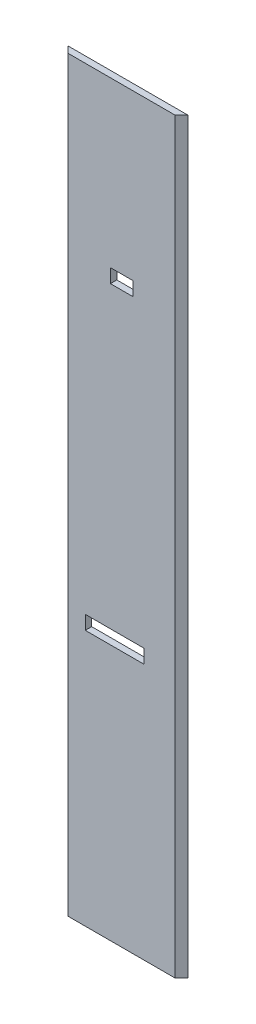
ISO-10303-21;
HEADER;
FILE_DESCRIPTION(('STEP AP214'),'2;1');
FILE_NAME('part.step','',(''),(''),'','','');
FILE_SCHEMA(('AUTOMOTIVE_DESIGN { 1 0 10303 214 1 1 1 1 }'));
ENDSEC;
DATA;
#1=APPLICATION_CONTEXT('core data for automotive mechanical design processes');
#2=APPLICATION_PROTOCOL_DEFINITION('international standard','automotive_design',2000,#1);
#3=PRODUCT_CONTEXT('',#1,'mechanical');
#4=PRODUCT('Part','Part','',(#3));
#5=PRODUCT_RELATED_PRODUCT_CATEGORY('part','',(#4));
#6=PRODUCT_DEFINITION_FORMATION('','',#4);
#7=PRODUCT_DEFINITION_CONTEXT('part definition',#1,'design');
#8=PRODUCT_DEFINITION('design','',#6,#7);
#9=PRODUCT_DEFINITION_SHAPE('','',#8);
#10=(LENGTH_UNIT() NAMED_UNIT(*) SI_UNIT(.MILLI.,.METRE.));
#11=(NAMED_UNIT(*) PLANE_ANGLE_UNIT() SI_UNIT($,.RADIAN.));
#12=(NAMED_UNIT(*) SI_UNIT($,.STERADIAN.) SOLID_ANGLE_UNIT());
#13=UNCERTAINTY_MEASURE_WITH_UNIT(LENGTH_MEASURE(1.E-05),#10,'distance_accuracy_value','');
#14=(GEOMETRIC_REPRESENTATION_CONTEXT(3) GLOBAL_UNCERTAINTY_ASSIGNED_CONTEXT((#13)) GLOBAL_UNIT_ASSIGNED_CONTEXT((#10,
#11,#12)) REPRESENTATION_CONTEXT('',''));
#15=CARTESIAN_POINT('',(0.,0.,0.));
#16=DIRECTION('',(0.,0.,1.));
#17=DIRECTION('',(1.,0.,0.));
#18=AXIS2_PLACEMENT_3D('',#15,#16,#17);
#19=CARTESIAN_POINT('',(25.,175.,3.));
#20=DIRECTION('',(0.707106781186554,0.,0.707106781186541));
#21=DIRECTION('',(0.707106781186541,0.,-0.707106781186554));
#22=AXIS2_PLACEMENT_3D('',#19,#20,#21);
#23=PLANE('',#22);
#24=DIRECTION('',(-0.707106781186541,0.,0.707106781186554));
#25=VECTOR('',#24,1.);
#26=CARTESIAN_POINT('',(25.,-175.,3.));
#27=LINE('',#26,#25);
#28=CARTESIAN_POINT('',(27.9999999999999,-175.,0.));
#29=VERTEX_POINT('',#28);
#30=CARTESIAN_POINT('',(25.,-175.,3.));
#31=VERTEX_POINT('',#30);
#32=EDGE_CURVE('E240',#29,#31,#27,.T.);
#33=ORIENTED_EDGE('',*,*,#32,.F.);
#34=DIRECTION('',(0.,-1.,0.));
#35=VECTOR('',#34,1.);
#36=CARTESIAN_POINT('',(27.9999999999999,175.,0.));
#37=LINE('',#36,#35);
#38=CARTESIAN_POINT('',(27.9999999999999,175.,0.));
#39=VERTEX_POINT('',#38);
#40=EDGE_CURVE('E230',#39,#29,#37,.T.);
#41=ORIENTED_EDGE('',*,*,#40,.F.);
#42=DIRECTION('',(-0.707106781186541,0.,0.707106781186554));
#43=VECTOR('',#42,1.);
#44=CARTESIAN_POINT('',(25.,175.,3.));
#45=LINE('',#44,#43);
#46=CARTESIAN_POINT('',(25.,175.,3.));
#47=VERTEX_POINT('',#46);
#48=EDGE_CURVE('E248',#39,#47,#45,.T.);
#49=ORIENTED_EDGE('',*,*,#48,.T.);
#50=DIRECTION('',(0.,1.,0.));
#51=VECTOR('',#50,1.);
#52=CARTESIAN_POINT('',(25.,-175.,3.));
#53=LINE('',#52,#51);
#54=EDGE_CURVE('E11',#31,#47,#53,.T.);
#55=ORIENTED_EDGE('',*,*,#54,.F.);
#56=EDGE_LOOP('',(#33,#41,#49,#55));
#57=FACE_BOUND('',#56,.T.);
#58=ADVANCED_FACE('F45',(#57),#23,.T.);
#59=CARTESIAN_POINT('',(25.,175.,3.));
#60=DIRECTION('',(0.,-1.,0.));
#61=DIRECTION('',(0.,0.,-1.));
#62=AXIS2_PLACEMENT_3D('',#59,#60,#61);
#63=PLANE('',#62);
#64=DIRECTION('',(-1.,0.,0.));
#65=VECTOR('',#64,1.);
#66=CARTESIAN_POINT('',(25.,175.,0.));
#67=LINE('',#66,#65);
#68=CARTESIAN_POINT('',(-27.9999999999999,175.,0.));
#69=VERTEX_POINT('',#68);
#70=EDGE_CURVE('E244',#39,#69,#67,.T.);
#71=ORIENTED_EDGE('',*,*,#70,.T.);
#72=DIRECTION('',(-0.707106781186541,0.,-0.707106781186554));
#73=VECTOR('',#72,1.);
#74=CARTESIAN_POINT('',(-25.,175.,3.));
#75=LINE('',#74,#73);
#76=CARTESIAN_POINT('',(-25.,175.,3.));
#77=VERTEX_POINT('',#76);
#78=EDGE_CURVE('E231',#77,#69,#75,.T.);
#79=ORIENTED_EDGE('',*,*,#78,.F.);
#80=DIRECTION('',(-1.,0.,0.));
#81=VECTOR('',#80,1.);
#82=CARTESIAN_POINT('',(25.,175.,3.));
#83=LINE('',#82,#81);
#84=EDGE_CURVE('E255',#47,#77,#83,.T.);
#85=ORIENTED_EDGE('',*,*,#84,.F.);
#86=ORIENTED_EDGE('',*,*,#48,.F.);
#87=EDGE_LOOP('',(#71,#79,#85,#86));
#88=FACE_BOUND('',#87,.T.);
#89=ADVANCED_FACE('F47',(#88),#63,.F.);
#90=CARTESIAN_POINT('',(25.,-175.,3.));
#91=DIRECTION('',(0.,1.,0.));
#92=DIRECTION('',(0.,0.,1.));
#93=AXIS2_PLACEMENT_3D('',#90,#91,#92);
#94=PLANE('',#93);
#95=DIRECTION('',(1.,0.,0.));
#96=VECTOR('',#95,1.);
#97=CARTESIAN_POINT('',(25.,-175.,0.));
#98=LINE('',#97,#96);
#99=CARTESIAN_POINT('',(-27.9999999999999,-175.,0.));
#100=VERTEX_POINT('',#99);
#101=EDGE_CURVE('E49',#100,#29,#98,.T.);
#102=ORIENTED_EDGE('',*,*,#101,.T.);
#103=ORIENTED_EDGE('',*,*,#32,.T.);
#104=DIRECTION('',(1.,0.,0.));
#105=VECTOR('',#104,1.);
#106=CARTESIAN_POINT('',(25.,-175.,3.));
#107=LINE('',#106,#105);
#108=CARTESIAN_POINT('',(-25.,-175.,3.));
#109=VERTEX_POINT('',#108);
#110=EDGE_CURVE('E55',#109,#31,#107,.T.);
#111=ORIENTED_EDGE('',*,*,#110,.F.);
#112=DIRECTION('',(-0.707106781186541,0.,-0.707106781186554));
#113=VECTOR('',#112,1.);
#114=CARTESIAN_POINT('',(-25.,-175.,3.));
#115=LINE('',#114,#113);
#116=EDGE_CURVE('E236',#109,#100,#115,.T.);
#117=ORIENTED_EDGE('',*,*,#116,.T.);
#118=EDGE_LOOP('',(#102,#103,#111,#117));
#119=FACE_BOUND('',#118,.T.);
#120=ADVANCED_FACE('F269',(#119),#94,.F.);
#121=CARTESIAN_POINT('',(0.,0.,3.));
#122=DIRECTION('',(0.,0.,-1.));
#123=DIRECTION('',(-1.,0.,0.));
#124=AXIS2_PLACEMENT_3D('',#121,#122,#123);
#125=PLANE('',#124);
#126=DIRECTION('',(0.,-1.,0.));
#127=VECTOR('',#126,1.);
#128=CARTESIAN_POINT('',(10.5,0.,3.));
#129=LINE('',#128,#127);
#130=CARTESIAN_POINT('',(10.5,-48.5,3.));
#131=VERTEX_POINT('',#130);
#132=CARTESIAN_POINT('',(10.5,-55.,3.));
#133=VERTEX_POINT('',#132);
#134=EDGE_CURVE('E222',#131,#133,#129,.T.);
#135=ORIENTED_EDGE('',*,*,#134,.T.);
#136=DIRECTION('',(-1.,0.,0.));
#137=VECTOR('',#136,1.);
#138=CARTESIAN_POINT('',(0.,-55.,3.));
#139=LINE('',#138,#137);
#140=CARTESIAN_POINT('',(-17.,-55.,3.));
#141=VERTEX_POINT('',#140);
#142=EDGE_CURVE('E226',#133,#141,#139,.T.);
#143=ORIENTED_EDGE('',*,*,#142,.T.);
#144=DIRECTION('',(0.,1.,0.));
#145=VECTOR('',#144,1.);
#146=CARTESIAN_POINT('',(-17.,0.,3.));
#147=LINE('',#146,#145);
#148=CARTESIAN_POINT('',(-17.,-48.5,3.));
#149=VERTEX_POINT('',#148);
#150=EDGE_CURVE('E217',#141,#149,#147,.T.);
#151=ORIENTED_EDGE('',*,*,#150,.T.);
#152=DIRECTION('',(1.,0.,0.));
#153=VECTOR('',#152,1.);
#154=CARTESIAN_POINT('',(0.,-48.5,3.));
#155=LINE('',#154,#153);
#156=EDGE_CURVE('E141',#149,#131,#155,.T.);
#157=ORIENTED_EDGE('',*,*,#156,.T.);
#158=EDGE_LOOP('',(#135,#143,#151,#157));
#159=FACE_BOUND('',#158,.T.);
#160=DIRECTION('',(1.,0.,0.));
#161=VECTOR('',#160,1.);
#162=CARTESIAN_POINT('',(0.,98.,3.));
#163=LINE('',#162,#161);
#164=CARTESIAN_POINT('',(-5.24999999999992,98.,3.));
#165=VERTEX_POINT('',#164);
#166=CARTESIAN_POINT('',(5.25000000000009,98.,3.));
#167=VERTEX_POINT('',#166);
#168=EDGE_CURVE('E209',#165,#167,#163,.T.);
#169=ORIENTED_EDGE('',*,*,#168,.T.);
#170=DIRECTION('',(0.,-1.,0.));
#171=VECTOR('',#170,1.);
#172=CARTESIAN_POINT('',(5.25000000000009,0.,3.));
#173=LINE('',#172,#171);
#174=CARTESIAN_POINT('',(5.25000000000009,91.5,3.));
#175=VERTEX_POINT('',#174);
#176=EDGE_CURVE('E213',#167,#175,#173,.T.);
#177=ORIENTED_EDGE('',*,*,#176,.T.);
#178=DIRECTION('',(-1.,0.,0.));
#179=VECTOR('',#178,1.);
#180=CARTESIAN_POINT('',(0.,91.5,3.));
#181=LINE('',#180,#179);
#182=CARTESIAN_POINT('',(-5.24999999999992,91.5,3.));
#183=VERTEX_POINT('',#182);
#184=EDGE_CURVE('E172',#175,#183,#181,.T.);
#185=ORIENTED_EDGE('',*,*,#184,.T.);
#186=DIRECTION('',(0.,1.,0.));
#187=VECTOR('',#186,1.);
#188=CARTESIAN_POINT('',(-5.24999999999992,0.,3.));
#189=LINE('',#188,#187);
#190=EDGE_CURVE('E205',#183,#165,#189,.T.);
#191=ORIENTED_EDGE('',*,*,#190,.T.);
#192=EDGE_LOOP('',(#169,#177,#185,#191));
#193=FACE_BOUND('',#192,.T.);
#194=ORIENTED_EDGE('',*,*,#84,.T.);
#195=DIRECTION('',(0.,-1.,0.));
#196=VECTOR('',#195,1.);
#197=CARTESIAN_POINT('',(-25.,-175.,3.));
#198=LINE('',#197,#196);
#199=EDGE_CURVE('E258',#77,#109,#198,.T.);
#200=ORIENTED_EDGE('',*,*,#199,.T.);
#201=ORIENTED_EDGE('',*,*,#110,.T.);
#202=ORIENTED_EDGE('',*,*,#54,.T.);
#203=EDGE_LOOP('',(#194,#200,#201,#202));
#204=FACE_BOUND('',#203,.T.);
#205=ADVANCED_FACE('F279',(#159,#193,#204),#125,.F.);
#206=CARTESIAN_POINT('',(0.,0.,0.));
#207=DIRECTION('',(0.,0.,-1.));
#208=DIRECTION('',(-1.,0.,0.));
#209=AXIS2_PLACEMENT_3D('',#206,#207,#208);
#210=PLANE('',#209);
#211=DIRECTION('',(-1.,0.,0.));
#212=VECTOR('',#211,1.);
#213=CARTESIAN_POINT('',(0.,-55.,0.));
#214=LINE('',#213,#212);
#215=CARTESIAN_POINT('',(10.5,-55.,0.));
#216=VERTEX_POINT('',#215);
#217=CARTESIAN_POINT('',(-17.,-55.,0.));
#218=VERTEX_POINT('',#217);
#219=EDGE_CURVE('E164',#216,#218,#214,.T.);
#220=ORIENTED_EDGE('',*,*,#219,.F.);
#221=DIRECTION('',(0.,-1.,0.));
#222=VECTOR('',#221,1.);
#223=CARTESIAN_POINT('',(10.5,-55.,0.));
#224=LINE('',#223,#222);
#225=CARTESIAN_POINT('',(10.5,-48.5,0.));
#226=VERTEX_POINT('',#225);
#227=EDGE_CURVE('E160',#226,#216,#224,.T.);
#228=ORIENTED_EDGE('',*,*,#227,.F.);
#229=DIRECTION('',(1.,0.,0.));
#230=VECTOR('',#229,1.);
#231=CARTESIAN_POINT('',(10.5,-48.5,0.));
#232=LINE('',#231,#230);
#233=CARTESIAN_POINT('',(-17.,-48.5,0.));
#234=VERTEX_POINT('',#233);
#235=EDGE_CURVE('E138',#234,#226,#232,.T.);
#236=ORIENTED_EDGE('',*,*,#235,.F.);
#237=DIRECTION('',(0.,1.,0.));
#238=VECTOR('',#237,1.);
#239=CARTESIAN_POINT('',(-17.,-48.5,0.));
#240=LINE('',#239,#238);
#241=EDGE_CURVE('E149',#218,#234,#240,.T.);
#242=ORIENTED_EDGE('',*,*,#241,.F.);
#243=EDGE_LOOP('',(#220,#228,#236,#242));
#244=FACE_BOUND('',#243,.T.);
#245=DIRECTION('',(0.,-1.,0.));
#246=VECTOR('',#245,1.);
#247=CARTESIAN_POINT('',(5.25000000000009,98.,0.));
#248=LINE('',#247,#246);
#249=CARTESIAN_POINT('',(5.25000000000009,98.,0.));
#250=VERTEX_POINT('',#249);
#251=CARTESIAN_POINT('',(5.25000000000009,91.5,0.));
#252=VERTEX_POINT('',#251);
#253=EDGE_CURVE('E155',#250,#252,#248,.T.);
#254=ORIENTED_EDGE('',*,*,#253,.F.);
#255=DIRECTION('',(1.,0.,0.));
#256=VECTOR('',#255,1.);
#257=CARTESIAN_POINT('',(-5.24999999999992,98.,0.));
#258=LINE('',#257,#256);
#259=CARTESIAN_POINT('',(-5.24999999999992,98.,0.));
#260=VERTEX_POINT('',#259);
#261=EDGE_CURVE('E181',#260,#250,#258,.T.);
#262=ORIENTED_EDGE('',*,*,#261,.F.);
#263=DIRECTION('',(0.,1.,0.));
#264=VECTOR('',#263,1.);
#265=CARTESIAN_POINT('',(-5.24999999999992,98.,0.));
#266=LINE('',#265,#264);
#267=CARTESIAN_POINT('',(-5.24999999999992,91.5,0.));
#268=VERTEX_POINT('',#267);
#269=EDGE_CURVE('E193',#268,#260,#266,.T.);
#270=ORIENTED_EDGE('',*,*,#269,.F.);
#271=DIRECTION('',(-1.,0.,0.));
#272=VECTOR('',#271,1.);
#273=CARTESIAN_POINT('',(-5.24999999999992,91.5,0.));
#274=LINE('',#273,#272);
#275=EDGE_CURVE('E197',#252,#268,#274,.T.);
#276=ORIENTED_EDGE('',*,*,#275,.F.);
#277=EDGE_LOOP('',(#254,#262,#270,#276));
#278=FACE_BOUND('',#277,.T.);
#279=ORIENTED_EDGE('',*,*,#70,.F.);
#280=ORIENTED_EDGE('',*,*,#40,.T.);
#281=ORIENTED_EDGE('',*,*,#101,.F.);
#282=DIRECTION('',(0.,-1.,0.));
#283=VECTOR('',#282,1.);
#284=CARTESIAN_POINT('',(-27.9999999999999,175.,0.));
#285=LINE('',#284,#283);
#286=EDGE_CURVE('E235',#69,#100,#285,.T.);
#287=ORIENTED_EDGE('',*,*,#286,.F.);
#288=EDGE_LOOP('',(#279,#280,#281,#287));
#289=FACE_BOUND('',#288,.T.);
#290=ADVANCED_FACE('F157',(#244,#278,#289),#210,.T.);
#291=CARTESIAN_POINT('',(-25.,175.,3.));
#292=DIRECTION('',(-0.707106781186554,0.,0.707106781186541));
#293=DIRECTION('',(0.707106781186541,0.,0.707106781186554));
#294=AXIS2_PLACEMENT_3D('',#291,#292,#293);
#295=PLANE('',#294);
#296=ORIENTED_EDGE('',*,*,#116,.F.);
#297=ORIENTED_EDGE('',*,*,#199,.F.);
#298=ORIENTED_EDGE('',*,*,#78,.T.);
#299=ORIENTED_EDGE('',*,*,#286,.T.);
#300=EDGE_LOOP('',(#296,#297,#298,#299));
#301=FACE_BOUND('',#300,.T.);
#302=ADVANCED_FACE('F282',(#301),#295,.T.);
#303=CARTESIAN_POINT('',(5.25000000000009,98.,10.));
#304=DIRECTION('',(1.,0.,0.));
#305=DIRECTION('',(0.,0.,-1.));
#306=AXIS2_PLACEMENT_3D('',#303,#304,#305);
#307=PLANE('',#306);
#308=DIRECTION('',(0.,0.,-1.));
#309=VECTOR('',#308,1.);
#310=CARTESIAN_POINT('',(5.25000000000009,98.,10.));
#311=LINE('',#310,#309);
#312=EDGE_CURVE('E187',#167,#250,#311,.T.);
#313=ORIENTED_EDGE('',*,*,#312,.T.);
#314=ORIENTED_EDGE('',*,*,#253,.T.);
#315=DIRECTION('',(0.,0.,-1.));
#316=VECTOR('',#315,1.);
#317=CARTESIAN_POINT('',(5.25000000000009,91.5,10.));
#318=LINE('',#317,#316);
#319=EDGE_CURVE('E177',#175,#252,#318,.T.);
#320=ORIENTED_EDGE('',*,*,#319,.F.);
#321=ORIENTED_EDGE('',*,*,#176,.F.);
#322=EDGE_LOOP('',(#313,#314,#320,#321));
#323=FACE_BOUND('',#322,.T.);
#324=ADVANCED_FACE('F284',(#323),#307,.F.);
#325=CARTESIAN_POINT('',(-5.24999999999992,98.,10.));
#326=DIRECTION('',(0.,1.,0.));
#327=DIRECTION('',(0.,0.,1.));
#328=AXIS2_PLACEMENT_3D('',#325,#326,#327);
#329=PLANE('',#328);
#330=DIRECTION('',(0.,0.,-1.));
#331=VECTOR('',#330,1.);
#332=CARTESIAN_POINT('',(-5.24999999999992,98.,10.));
#333=LINE('',#332,#331);
#334=EDGE_CURVE('E184',#165,#260,#333,.T.);
#335=ORIENTED_EDGE('',*,*,#334,.T.);
#336=ORIENTED_EDGE('',*,*,#261,.T.);
#337=ORIENTED_EDGE('',*,*,#312,.F.);
#338=ORIENTED_EDGE('',*,*,#168,.F.);
#339=EDGE_LOOP('',(#335,#336,#337,#338));
#340=FACE_BOUND('',#339,.T.);
#341=ADVANCED_FACE('F291',(#340),#329,.F.);
#342=CARTESIAN_POINT('',(-5.24999999999992,98.,10.));
#343=DIRECTION('',(-1.,0.,0.));
#344=DIRECTION('',(0.,0.,1.));
#345=AXIS2_PLACEMENT_3D('',#342,#343,#344);
#346=PLANE('',#345);
#347=DIRECTION('',(0.,0.,-1.));
#348=VECTOR('',#347,1.);
#349=CARTESIAN_POINT('',(-5.24999999999992,91.5,10.));
#350=LINE('',#349,#348);
#351=EDGE_CURVE('E71',#183,#268,#350,.T.);
#352=ORIENTED_EDGE('',*,*,#351,.T.);
#353=ORIENTED_EDGE('',*,*,#269,.T.);
#354=ORIENTED_EDGE('',*,*,#334,.F.);
#355=ORIENTED_EDGE('',*,*,#190,.F.);
#356=EDGE_LOOP('',(#352,#353,#354,#355));
#357=FACE_BOUND('',#356,.T.);
#358=ADVANCED_FACE('F360',(#357),#346,.F.);
#359=CARTESIAN_POINT('',(-5.24999999999992,91.5,10.));
#360=DIRECTION('',(0.,-1.,0.));
#361=DIRECTION('',(0.,0.,-1.));
#362=AXIS2_PLACEMENT_3D('',#359,#360,#361);
#363=PLANE('',#362);
#364=ORIENTED_EDGE('',*,*,#319,.T.);
#365=ORIENTED_EDGE('',*,*,#275,.T.);
#366=ORIENTED_EDGE('',*,*,#351,.F.);
#367=ORIENTED_EDGE('',*,*,#184,.F.);
#368=EDGE_LOOP('',(#364,#365,#366,#367));
#369=FACE_BOUND('',#368,.T.);
#370=ADVANCED_FACE('F368',(#369),#363,.F.);
#371=CARTESIAN_POINT('',(0.,-55.,10.));
#372=DIRECTION('',(0.,-1.,0.));
#373=DIRECTION('',(0.,0.,-1.));
#374=AXIS2_PLACEMENT_3D('',#371,#372,#373);
#375=PLANE('',#374);
#376=DIRECTION('',(0.,0.,-1.));
#377=VECTOR('',#376,1.);
#378=CARTESIAN_POINT('',(10.5,-55.,10.));
#379=LINE('',#378,#377);
#380=EDGE_CURVE('E169',#133,#216,#379,.T.);
#381=ORIENTED_EDGE('',*,*,#380,.T.);
#382=ORIENTED_EDGE('',*,*,#219,.T.);
#383=DIRECTION('',(0.,0.,-1.));
#384=VECTOR('',#383,1.);
#385=CARTESIAN_POINT('',(-17.,-55.,10.));
#386=LINE('',#385,#384);
#387=EDGE_CURVE('E145',#141,#218,#386,.T.);
#388=ORIENTED_EDGE('',*,*,#387,.F.);
#389=ORIENTED_EDGE('',*,*,#142,.F.);
#390=EDGE_LOOP('',(#381,#382,#388,#389));
#391=FACE_BOUND('',#390,.T.);
#392=ADVANCED_FACE('F377',(#391),#375,.F.);
#393=CARTESIAN_POINT('',(10.5,-55.,10.));
#394=DIRECTION('',(1.,0.,0.));
#395=DIRECTION('',(0.,0.,-1.));
#396=AXIS2_PLACEMENT_3D('',#393,#394,#395);
#397=PLANE('',#396);
#398=DIRECTION('',(0.,0.,-1.));
#399=VECTOR('',#398,1.);
#400=CARTESIAN_POINT('',(10.5,-48.5,10.));
#401=LINE('',#400,#399);
#402=EDGE_CURVE('E144',#131,#226,#401,.T.);
#403=ORIENTED_EDGE('',*,*,#402,.T.);
#404=ORIENTED_EDGE('',*,*,#227,.T.);
#405=ORIENTED_EDGE('',*,*,#380,.F.);
#406=ORIENTED_EDGE('',*,*,#134,.F.);
#407=EDGE_LOOP('',(#403,#404,#405,#406));
#408=FACE_BOUND('',#407,.T.);
#409=ADVANCED_FACE('F385',(#408),#397,.F.);
#410=CARTESIAN_POINT('',(10.5,-48.5,10.));
#411=DIRECTION('',(0.,1.,0.));
#412=DIRECTION('',(0.,0.,1.));
#413=AXIS2_PLACEMENT_3D('',#410,#411,#412);
#414=PLANE('',#413);
#415=DIRECTION('',(0.,0.,-1.));
#416=VECTOR('',#415,1.);
#417=CARTESIAN_POINT('',(-17.,-48.5,10.));
#418=LINE('',#417,#416);
#419=EDGE_CURVE('E63',#149,#234,#418,.T.);
#420=ORIENTED_EDGE('',*,*,#419,.T.);
#421=ORIENTED_EDGE('',*,*,#235,.T.);
#422=ORIENTED_EDGE('',*,*,#402,.F.);
#423=ORIENTED_EDGE('',*,*,#156,.F.);
#424=EDGE_LOOP('',(#420,#421,#422,#423));
#425=FACE_BOUND('',#424,.T.);
#426=ADVANCED_FACE('F135',(#425),#414,.F.);
#427=CARTESIAN_POINT('',(-17.,-48.5,10.));
#428=DIRECTION('',(-1.,0.,0.));
#429=DIRECTION('',(0.,0.,1.));
#430=AXIS2_PLACEMENT_3D('',#427,#428,#429);
#431=PLANE('',#430);
#432=ORIENTED_EDGE('',*,*,#387,.T.);
#433=ORIENTED_EDGE('',*,*,#241,.T.);
#434=ORIENTED_EDGE('',*,*,#419,.F.);
#435=ORIENTED_EDGE('',*,*,#150,.F.);
#436=EDGE_LOOP('',(#432,#433,#434,#435));
#437=FACE_BOUND('',#436,.T.);
#438=ADVANCED_FACE('F150',(#437),#431,.F.);
#439=CLOSED_SHELL('',(#58,#89,#120,#205,#290,#302,#324,#341,#358,#370,#392,#409,#426,#438));
#440=MANIFOLD_SOLID_BREP('B2',#439);
#441=ADVANCED_BREP_SHAPE_REPRESENTATION('',(#18,#440),#14);
#442=SHAPE_DEFINITION_REPRESENTATION(#9,#441);
ENDSEC;
END-ISO-10303-21;
